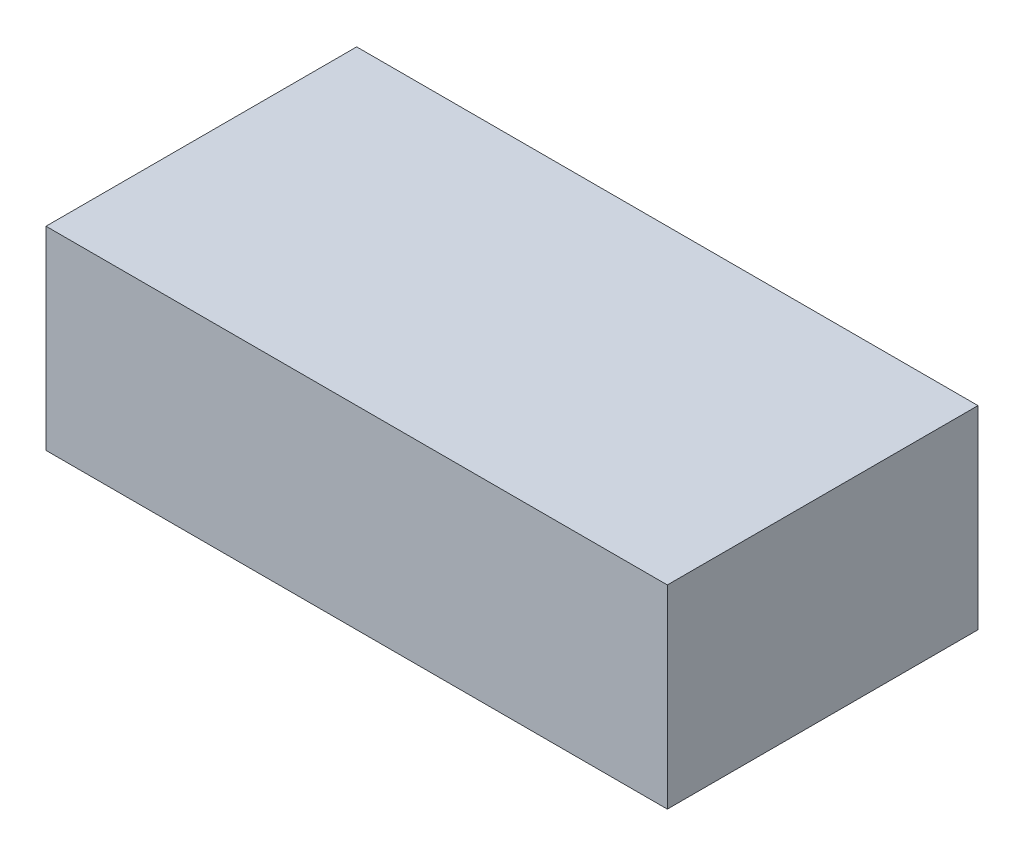
ISO-10303-21;
HEADER;
FILE_DESCRIPTION(('STEP AP214'),'2;1');
FILE_NAME('part.step','',(''),(''),'','','');
FILE_SCHEMA(('AUTOMOTIVE_DESIGN { 1 0 10303 214 1 1 1 1 }'));
ENDSEC;
DATA;
#1=APPLICATION_CONTEXT('core data for automotive mechanical design processes');
#2=APPLICATION_PROTOCOL_DEFINITION('international standard','automotive_design',2000,#1);
#3=PRODUCT_CONTEXT('',#1,'mechanical');
#4=PRODUCT('Part','Part','',(#3));
#5=PRODUCT_RELATED_PRODUCT_CATEGORY('part','',(#4));
#6=PRODUCT_DEFINITION_FORMATION('','',#4);
#7=PRODUCT_DEFINITION_CONTEXT('part definition',#1,'design');
#8=PRODUCT_DEFINITION('design','',#6,#7);
#9=PRODUCT_DEFINITION_SHAPE('','',#8);
#10=(LENGTH_UNIT() NAMED_UNIT(*) SI_UNIT(.MILLI.,.METRE.));
#11=(NAMED_UNIT(*) PLANE_ANGLE_UNIT() SI_UNIT($,.RADIAN.));
#12=(NAMED_UNIT(*) SI_UNIT($,.STERADIAN.) SOLID_ANGLE_UNIT());
#13=UNCERTAINTY_MEASURE_WITH_UNIT(LENGTH_MEASURE(1.E-05),#10,'distance_accuracy_value','');
#14=(GEOMETRIC_REPRESENTATION_CONTEXT(3) GLOBAL_UNCERTAINTY_ASSIGNED_CONTEXT((#13)) GLOBAL_UNIT_ASSIGNED_CONTEXT((#10,
#11,#12)) REPRESENTATION_CONTEXT('',''));
#15=CARTESIAN_POINT('',(0.,0.,0.));
#16=DIRECTION('',(0.,0.,1.));
#17=DIRECTION('',(1.,0.,0.));
#18=AXIS2_PLACEMENT_3D('',#15,#16,#17);
#19=CARTESIAN_POINT('',(0.,31.75,0.));
#20=DIRECTION('',(1.,0.,0.));
#21=DIRECTION('',(0.,0.,-1.));
#22=AXIS2_PLACEMENT_3D('',#19,#20,#21);
#23=PLANE('',#22);
#24=DIRECTION('',(0.,0.,1.));
#25=VECTOR('',#24,1.);
#26=CARTESIAN_POINT('',(0.,0.,0.));
#27=LINE('',#26,#25);
#28=CARTESIAN_POINT('',(0.,0.,-50.8));
#29=VERTEX_POINT('',#28);
#30=CARTESIAN_POINT('',(0.,0.,0.));
#31=VERTEX_POINT('',#30);
#32=EDGE_CURVE('E96',#29,#31,#27,.T.);
#33=ORIENTED_EDGE('',*,*,#32,.T.);
#34=DIRECTION('',(0.,-1.,0.));
#35=VECTOR('',#34,1.);
#36=CARTESIAN_POINT('',(0.,31.75,0.));
#37=LINE('',#36,#35);
#38=CARTESIAN_POINT('',(0.,31.75,0.));
#39=VERTEX_POINT('',#38);
#40=EDGE_CURVE('E11',#39,#31,#37,.T.);
#41=ORIENTED_EDGE('',*,*,#40,.F.);
#42=DIRECTION('',(0.,0.,1.));
#43=VECTOR('',#42,1.);
#44=CARTESIAN_POINT('',(0.,31.75,0.));
#45=LINE('',#44,#43);
#46=CARTESIAN_POINT('',(0.,31.75,-50.8));
#47=VERTEX_POINT('',#46);
#48=EDGE_CURVE('E84',#47,#39,#45,.T.);
#49=ORIENTED_EDGE('',*,*,#48,.F.);
#50=DIRECTION('',(0.,-1.,0.));
#51=VECTOR('',#50,1.);
#52=CARTESIAN_POINT('',(0.,31.75,-50.8));
#53=LINE('',#52,#51);
#54=EDGE_CURVE('E92',#47,#29,#53,.T.);
#55=ORIENTED_EDGE('',*,*,#54,.T.);
#56=EDGE_LOOP('',(#33,#41,#49,#55));
#57=FACE_BOUND('',#56,.T.);
#58=ADVANCED_FACE('F33',(#57),#23,.F.);
#59=CARTESIAN_POINT('',(0.,31.75,0.));
#60=DIRECTION('',(0.,0.,-1.));
#61=DIRECTION('',(-1.,0.,0.));
#62=AXIS2_PLACEMENT_3D('',#59,#60,#61);
#63=PLANE('',#62);
#64=DIRECTION('',(1.,0.,0.));
#65=VECTOR('',#64,1.);
#66=CARTESIAN_POINT('',(0.,0.,0.));
#67=LINE('',#66,#65);
#68=CARTESIAN_POINT('',(101.6,0.,0.));
#69=VERTEX_POINT('',#68);
#70=EDGE_CURVE('E88',#31,#69,#67,.T.);
#71=ORIENTED_EDGE('',*,*,#70,.T.);
#72=DIRECTION('',(0.,-1.,0.));
#73=VECTOR('',#72,1.);
#74=CARTESIAN_POINT('',(101.6,31.75,0.));
#75=LINE('',#74,#73);
#76=CARTESIAN_POINT('',(101.6,31.75,0.));
#77=VERTEX_POINT('',#76);
#78=EDGE_CURVE('E41',#77,#69,#75,.T.);
#79=ORIENTED_EDGE('',*,*,#78,.F.);
#80=DIRECTION('',(1.,0.,0.));
#81=VECTOR('',#80,1.);
#82=CARTESIAN_POINT('',(0.,31.75,0.));
#83=LINE('',#82,#81);
#84=EDGE_CURVE('E79',#39,#77,#83,.T.);
#85=ORIENTED_EDGE('',*,*,#84,.F.);
#86=ORIENTED_EDGE('',*,*,#40,.T.);
#87=EDGE_LOOP('',(#71,#79,#85,#86));
#88=FACE_BOUND('',#87,.T.);
#89=ADVANCED_FACE('F87',(#88),#63,.F.);
#90=CARTESIAN_POINT('',(101.6,31.75,0.));
#91=DIRECTION('',(-1.,0.,0.));
#92=DIRECTION('',(0.,0.,1.));
#93=AXIS2_PLACEMENT_3D('',#90,#91,#92);
#94=PLANE('',#93);
#95=DIRECTION('',(0.,0.,-1.));
#96=VECTOR('',#95,1.);
#97=CARTESIAN_POINT('',(101.6,0.,0.));
#98=LINE('',#97,#96);
#99=CARTESIAN_POINT('',(101.6,0.,-50.8));
#100=VERTEX_POINT('',#99);
#101=EDGE_CURVE('E66',#69,#100,#98,.T.);
#102=ORIENTED_EDGE('',*,*,#101,.T.);
#103=DIRECTION('',(0.,-1.,0.));
#104=VECTOR('',#103,1.);
#105=CARTESIAN_POINT('',(101.6,31.75,-50.8));
#106=LINE('',#105,#104);
#107=CARTESIAN_POINT('',(101.6,31.75,-50.8));
#108=VERTEX_POINT('',#107);
#109=EDGE_CURVE('E89',#108,#100,#106,.T.);
#110=ORIENTED_EDGE('',*,*,#109,.F.);
#111=DIRECTION('',(0.,0.,-1.));
#112=VECTOR('',#111,1.);
#113=CARTESIAN_POINT('',(101.6,31.75,0.));
#114=LINE('',#113,#112);
#115=EDGE_CURVE('E82',#77,#108,#114,.T.);
#116=ORIENTED_EDGE('',*,*,#115,.F.);
#117=ORIENTED_EDGE('',*,*,#78,.T.);
#118=EDGE_LOOP('',(#102,#110,#116,#117));
#119=FACE_BOUND('',#118,.T.);
#120=ADVANCED_FACE('F90',(#119),#94,.F.);
#121=CARTESIAN_POINT('',(0.,31.75,-50.8));
#122=DIRECTION('',(0.,0.,1.));
#123=DIRECTION('',(1.,0.,0.));
#124=AXIS2_PLACEMENT_3D('',#121,#122,#123);
#125=PLANE('',#124);
#126=DIRECTION('',(-1.,0.,0.));
#127=VECTOR('',#126,1.);
#128=CARTESIAN_POINT('',(0.,0.,-50.8));
#129=LINE('',#128,#127);
#130=EDGE_CURVE('E72',#100,#29,#129,.T.);
#131=ORIENTED_EDGE('',*,*,#130,.T.);
#132=ORIENTED_EDGE('',*,*,#54,.F.);
#133=DIRECTION('',(-1.,0.,0.));
#134=VECTOR('',#133,1.);
#135=CARTESIAN_POINT('',(0.,31.75,-50.8));
#136=LINE('',#135,#134);
#137=EDGE_CURVE('E49',#108,#47,#136,.T.);
#138=ORIENTED_EDGE('',*,*,#137,.F.);
#139=ORIENTED_EDGE('',*,*,#109,.T.);
#140=EDGE_LOOP('',(#131,#132,#138,#139));
#141=FACE_BOUND('',#140,.T.);
#142=ADVANCED_FACE('F103',(#141),#125,.F.);
#143=CARTESIAN_POINT('',(0.,31.75,0.));
#144=DIRECTION('',(0.,-1.,0.));
#145=DIRECTION('',(0.,0.,-1.));
#146=AXIS2_PLACEMENT_3D('',#143,#144,#145);
#147=PLANE('',#146);
#148=ORIENTED_EDGE('',*,*,#48,.T.);
#149=ORIENTED_EDGE('',*,*,#84,.T.);
#150=ORIENTED_EDGE('',*,*,#115,.T.);
#151=ORIENTED_EDGE('',*,*,#137,.T.);
#152=EDGE_LOOP('',(#148,#149,#150,#151));
#153=FACE_BOUND('',#152,.T.);
#154=ADVANCED_FACE('F80',(#153),#147,.F.);
#155=CARTESIAN_POINT('',(0.,0.,0.));
#156=DIRECTION('',(0.,-1.,0.));
#157=DIRECTION('',(0.,0.,-1.));
#158=AXIS2_PLACEMENT_3D('',#155,#156,#157);
#159=PLANE('',#158);
#160=ORIENTED_EDGE('',*,*,#32,.F.);
#161=ORIENTED_EDGE('',*,*,#130,.F.);
#162=ORIENTED_EDGE('',*,*,#101,.F.);
#163=ORIENTED_EDGE('',*,*,#70,.F.);
#164=EDGE_LOOP('',(#160,#161,#162,#163));
#165=FACE_BOUND('',#164,.T.);
#166=ADVANCED_FACE('F106',(#165),#159,.T.);
#167=CLOSED_SHELL('',(#58,#89,#120,#142,#154,#166));
#168=MANIFOLD_SOLID_BREP('B2',#167);
#169=ADVANCED_BREP_SHAPE_REPRESENTATION('',(#18,#168),#14);
#170=SHAPE_DEFINITION_REPRESENTATION(#9,#169);
ENDSEC;
END-ISO-10303-21;
